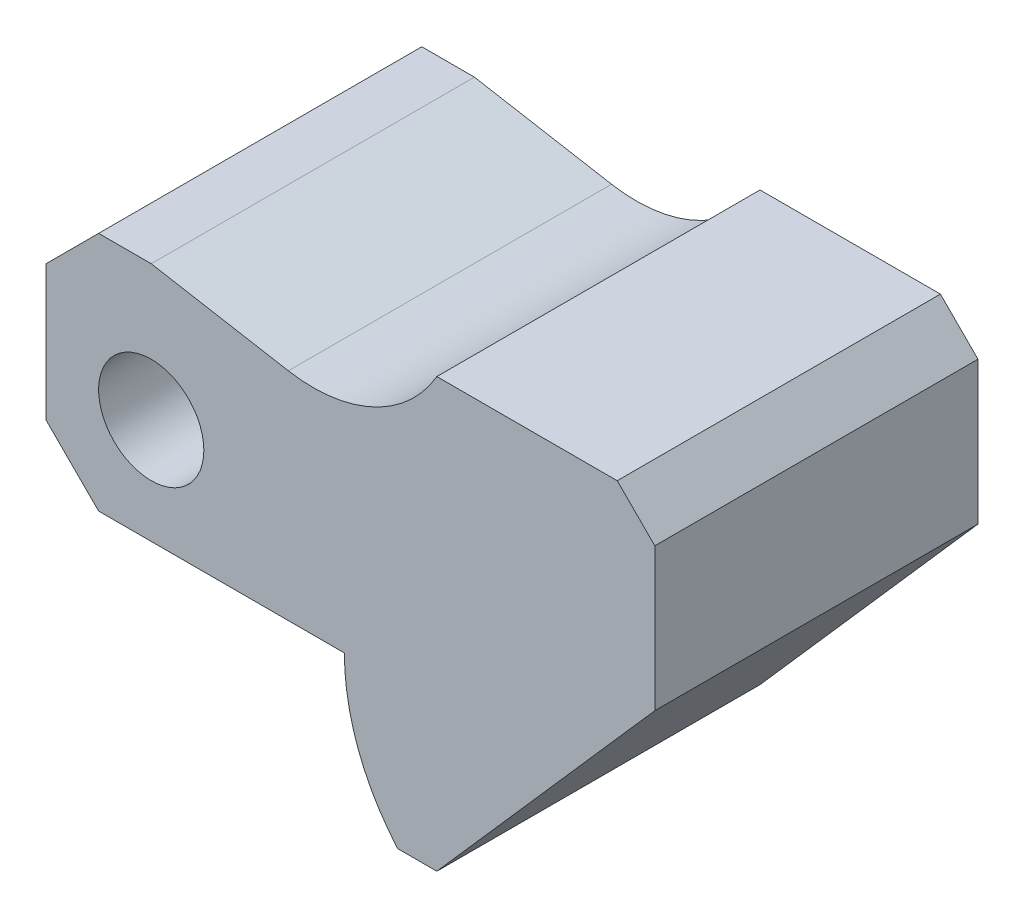
ISO-10303-21;
HEADER;
FILE_DESCRIPTION(('STEP AP214'),'2;1');
FILE_NAME('part.step','',(''),(''),'','','');
FILE_SCHEMA(('AUTOMOTIVE_DESIGN { 1 0 10303 214 1 1 1 1 }'));
ENDSEC;
DATA;
#1=APPLICATION_CONTEXT('core data for automotive mechanical design processes');
#2=APPLICATION_PROTOCOL_DEFINITION('international standard','automotive_design',2000,#1);
#3=PRODUCT_CONTEXT('',#1,'mechanical');
#4=PRODUCT('Part','Part','',(#3));
#5=PRODUCT_RELATED_PRODUCT_CATEGORY('part','',(#4));
#6=PRODUCT_DEFINITION_FORMATION('','',#4);
#7=PRODUCT_DEFINITION_CONTEXT('part definition',#1,'design');
#8=PRODUCT_DEFINITION('design','',#6,#7);
#9=PRODUCT_DEFINITION_SHAPE('','',#8);
#10=(LENGTH_UNIT() NAMED_UNIT(*) SI_UNIT(.MILLI.,.METRE.));
#11=(NAMED_UNIT(*) PLANE_ANGLE_UNIT() SI_UNIT($,.RADIAN.));
#12=(NAMED_UNIT(*) SI_UNIT($,.STERADIAN.) SOLID_ANGLE_UNIT());
#13=UNCERTAINTY_MEASURE_WITH_UNIT(LENGTH_MEASURE(1.E-05),#10,'distance_accuracy_value','');
#14=(GEOMETRIC_REPRESENTATION_CONTEXT(3) GLOBAL_UNCERTAINTY_ASSIGNED_CONTEXT((#13)) GLOBAL_UNIT_ASSIGNED_CONTEXT((#10,
#11,#12)) REPRESENTATION_CONTEXT('',''));
#15=CARTESIAN_POINT('',(0.,0.,0.));
#16=DIRECTION('',(0.,0.,1.));
#17=DIRECTION('',(1.,0.,0.));
#18=AXIS2_PLACEMENT_3D('',#15,#16,#17);
#19=CARTESIAN_POINT('',(52.,-19.,0.));
#20=DIRECTION('',(0.,-1.,0.));
#21=DIRECTION('',(0.,0.,-1.));
#22=AXIS2_PLACEMENT_3D('',#19,#20,#21);
#23=PLANE('',#22);
#24=DIRECTION('',(-1.,0.,0.));
#25=VECTOR('',#24,1.);
#26=CARTESIAN_POINT('',(52.,-19.,43.));
#27=LINE('',#26,#25);
#28=CARTESIAN_POINT('',(23.,-19.,43.));
#29=VERTEX_POINT('',#28);
#30=CARTESIAN_POINT('',(17.7880673967631,-19.,43.));
#31=VERTEX_POINT('',#30);
#32=EDGE_CURVE('E186',#29,#31,#27,.T.);
#33=ORIENTED_EDGE('',*,*,#32,.T.);
#34=DIRECTION('',(0.,0.,1.));
#35=VECTOR('',#34,1.);
#36=CARTESIAN_POINT('',(17.7880673967631,-19.,0.));
#37=LINE('',#36,#35);
#38=CARTESIAN_POINT('',(17.7880673967631,-19.,0.));
#39=VERTEX_POINT('',#38);
#40=EDGE_CURVE('E155',#39,#31,#37,.T.);
#41=ORIENTED_EDGE('',*,*,#40,.F.);
#42=DIRECTION('',(-1.,0.,0.));
#43=VECTOR('',#42,1.);
#44=CARTESIAN_POINT('',(52.,-19.,0.));
#45=LINE('',#44,#43);
#46=CARTESIAN_POINT('',(23.,-19.,0.));
#47=VERTEX_POINT('',#46);
#48=EDGE_CURVE('E160',#47,#39,#45,.T.);
#49=ORIENTED_EDGE('',*,*,#48,.F.);
#50=DIRECTION('',(0.,0.,1.));
#51=VECTOR('',#50,1.);
#52=CARTESIAN_POINT('',(23.,-19.,-9.));
#53=LINE('',#52,#51);
#54=EDGE_CURVE('E54',#47,#29,#53,.T.);
#55=ORIENTED_EDGE('',*,*,#54,.T.);
#56=EDGE_LOOP('',(#33,#41,#49,#55));
#57=FACE_BOUND('',#56,.T.);
#58=ADVANCED_FACE('F40',(#57),#23,.T.);
#59=CARTESIAN_POINT('',(-29.,0.,43.));
#60=DIRECTION('',(0.,0.,-1.));
#61=DIRECTION('',(-1.,0.,0.));
#62=AXIS2_PLACEMENT_3D('',#59,#60,#61);
#63=PLANE('',#62);
#64=CARTESIAN_POINT('',(-15.,14.,43.));
#65=DIRECTION('',(0.,0.,1.));
#66=DIRECTION('',(1.,0.,0.));
#67=AXIS2_PLACEMENT_3D('',#64,#65,#66);
#68=CIRCLE('',#67,7.);
#69=CARTESIAN_POINT('',(-8.,14.,43.));
#70=VERTEX_POINT('',#69);
#71=EDGE_CURVE('E169',#70,#70,#68,.T.);
#72=ORIENTED_EDGE('',*,*,#71,.F.);
#73=EDGE_LOOP('',(#72));
#74=FACE_BOUND('',#73,.T.);
#75=CARTESIAN_POINT('',(39.6969696969697,0.,43.));
#76=DIRECTION('',(0.,0.,1.));
#77=DIRECTION('',(1.,0.,0.));
#78=AXIS2_PLACEMENT_3D('',#75,#76,#77);
#79=CIRCLE('',#78,29.);
#80=CARTESIAN_POINT('',(10.6969696969697,-1.89158424479087E-13,43.));
#81=VERTEX_POINT('',#80);
#82=EDGE_CURVE('E154',#81,#31,#79,.T.);
#83=ORIENTED_EDGE('',*,*,#82,.T.);
#84=ORIENTED_EDGE('',*,*,#32,.F.);
#85=DIRECTION('',(-0.660114607728679,-0.751164898449876,0.));
#86=VECTOR('',#85,1.);
#87=CARTESIAN_POINT('',(52.,14.,43.));
#88=LINE('',#87,#86);
#89=CARTESIAN_POINT('',(52.,14.,43.));
#90=VERTEX_POINT('',#89);
#91=EDGE_CURVE('E164',#90,#29,#88,.T.);
#92=ORIENTED_EDGE('',*,*,#91,.F.);
#93=DIRECTION('',(0.,1.,0.));
#94=VECTOR('',#93,1.);
#95=CARTESIAN_POINT('',(52.,0.,43.));
#96=LINE('',#95,#94);
#97=CARTESIAN_POINT('',(52.,33.,43.));
#98=VERTEX_POINT('',#97);
#99=EDGE_CURVE('E174',#90,#98,#96,.T.);
#100=ORIENTED_EDGE('',*,*,#99,.T.);
#101=DIRECTION('',(-0.707106781186549,0.707106781186546,0.));
#102=VECTOR('',#101,1.);
#103=CARTESIAN_POINT('',(52.,33.,43.));
#104=LINE('',#103,#102);
#105=CARTESIAN_POINT('',(47.,38.,43.));
#106=VERTEX_POINT('',#105);
#107=EDGE_CURVE('E221',#98,#106,#104,.T.);
#108=ORIENTED_EDGE('',*,*,#107,.T.);
#109=DIRECTION('',(-1.,0.,0.));
#110=VECTOR('',#109,1.);
#111=CARTESIAN_POINT('',(52.,38.,43.));
#112=LINE('',#111,#110);
#113=CARTESIAN_POINT('',(23.,38.,43.));
#114=VERTEX_POINT('',#113);
#115=EDGE_CURVE('E180',#106,#114,#112,.T.);
#116=ORIENTED_EDGE('',*,*,#115,.T.);
#117=CARTESIAN_POINT('',(6.54240036354729,47.4945992125119,43.));
#118=DIRECTION('',(0.,0.,-1.));
#119=DIRECTION('',(-1.,0.,0.));
#120=AXIS2_PLACEMENT_3D('',#117,#118,#119);
#121=CIRCLE('',#120,19.);
#122=CARTESIAN_POINT('',(3.24308498787561,28.7832519052799,43.));
#123=VERTEX_POINT('',#122);
#124=EDGE_CURVE('E62',#114,#123,#121,.T.);
#125=ORIENTED_EDGE('',*,*,#124,.T.);
#126=DIRECTION('',(-0.984807753012208,0.173648177666931,0.));
#127=VECTOR('',#126,1.);
#128=CARTESIAN_POINT('',(-23.1055260522907,33.4292229358542,43.));
#129=LINE('',#128,#127);
#130=CARTESIAN_POINT('',(-15.0000000000001,32.,43.));
#131=VERTEX_POINT('',#130);
#132=EDGE_CURVE('E231',#123,#131,#129,.T.);
#133=ORIENTED_EDGE('',*,*,#132,.T.);
#134=DIRECTION('',(1.,0.,0.));
#135=VECTOR('',#134,1.);
#136=CARTESIAN_POINT('',(-29.,32.,43.));
#137=LINE('',#136,#135);
#138=CARTESIAN_POINT('',(-22.,32.,43.));
#139=VERTEX_POINT('',#138);
#140=EDGE_CURVE('E195',#139,#131,#137,.T.);
#141=ORIENTED_EDGE('',*,*,#140,.F.);
#142=DIRECTION('',(0.707106781186546,0.707106781186549,0.));
#143=VECTOR('',#142,1.);
#144=CARTESIAN_POINT('',(-22.,32.,43.));
#145=LINE('',#144,#143);
#146=CARTESIAN_POINT('',(-29.,25.,43.));
#147=VERTEX_POINT('',#146);
#148=EDGE_CURVE('E206',#139,#147,#145,.F.);
#149=ORIENTED_EDGE('',*,*,#148,.T.);
#150=DIRECTION('',(0.,1.,0.));
#151=VECTOR('',#150,1.);
#152=CARTESIAN_POINT('',(-29.,0.,43.));
#153=LINE('',#152,#151);
#154=CARTESIAN_POINT('',(-29.,6.99999999999999,43.));
#155=VERTEX_POINT('',#154);
#156=EDGE_CURVE('E189',#155,#147,#153,.T.);
#157=ORIENTED_EDGE('',*,*,#156,.F.);
#158=DIRECTION('',(0.707106781186549,-0.707106781186546,0.));
#159=VECTOR('',#158,1.);
#160=CARTESIAN_POINT('',(-29.,6.99999999999999,43.));
#161=LINE('',#160,#159);
#162=CARTESIAN_POINT('',(-22.,0.,43.));
#163=VERTEX_POINT('',#162);
#164=EDGE_CURVE('E208',#155,#163,#161,.T.);
#165=ORIENTED_EDGE('',*,*,#164,.T.);
#166=DIRECTION('',(1.,0.,0.));
#167=VECTOR('',#166,1.);
#168=CARTESIAN_POINT('',(-29.,0.,43.));
#169=LINE('',#168,#167);
#170=EDGE_CURVE('E147',#163,#81,#169,.T.);
#171=ORIENTED_EDGE('',*,*,#170,.T.);
#172=EDGE_LOOP('',(#83,#84,#92,#100,#108,#116,#125,#133,#141,#149,#157,#165,#171));
#173=FACE_BOUND('',#172,.T.);
#174=ADVANCED_FACE('F255',(#74,#173),#63,.F.);
#175=CARTESIAN_POINT('',(-29.,0.,0.));
#176=DIRECTION('',(0.,0.,-1.));
#177=DIRECTION('',(0.,1.,0.));
#178=AXIS2_PLACEMENT_3D('',#175,#176,#177);
#179=PLANE('',#178);
#180=CARTESIAN_POINT('',(-15.,14.,0.));
#181=DIRECTION('',(0.,0.,1.));
#182=DIRECTION('',(1.,0.,0.));
#183=AXIS2_PLACEMENT_3D('',#180,#181,#182);
#184=CIRCLE('',#183,7.);
#185=CARTESIAN_POINT('',(-8.,14.,0.));
#186=VERTEX_POINT('',#185);
#187=EDGE_CURVE('E171',#186,#186,#184,.T.);
#188=ORIENTED_EDGE('',*,*,#187,.T.);
#189=EDGE_LOOP('',(#188));
#190=FACE_BOUND('',#189,.T.);
#191=ORIENTED_EDGE('',*,*,#48,.T.);
#192=CARTESIAN_POINT('',(39.6969696969697,0.,0.));
#193=DIRECTION('',(0.,0.,1.));
#194=DIRECTION('',(1.,0.,0.));
#195=AXIS2_PLACEMENT_3D('',#192,#193,#194);
#196=CIRCLE('',#195,29.);
#197=CARTESIAN_POINT('',(10.6969696969697,-1.89158424479087E-13,0.));
#198=VERTEX_POINT('',#197);
#199=EDGE_CURVE('E151',#198,#39,#196,.T.);
#200=ORIENTED_EDGE('',*,*,#199,.F.);
#201=DIRECTION('',(1.,0.,0.));
#202=VECTOR('',#201,1.);
#203=CARTESIAN_POINT('',(-29.,0.,0.));
#204=LINE('',#203,#202);
#205=CARTESIAN_POINT('',(-22.,0.,0.));
#206=VERTEX_POINT('',#205);
#207=EDGE_CURVE('E135',#206,#198,#204,.T.);
#208=ORIENTED_EDGE('',*,*,#207,.F.);
#209=DIRECTION('',(-0.707106781186549,0.707106781186546,0.));
#210=VECTOR('',#209,1.);
#211=CARTESIAN_POINT('',(-25.5,3.50000000000001,0.));
#212=LINE('',#211,#210);
#213=CARTESIAN_POINT('',(-29.,6.99999999999999,0.));
#214=VERTEX_POINT('',#213);
#215=EDGE_CURVE('E213',#206,#214,#212,.T.);
#216=ORIENTED_EDGE('',*,*,#215,.T.);
#217=DIRECTION('',(0.,1.,0.));
#218=VECTOR('',#217,1.);
#219=CARTESIAN_POINT('',(-29.,0.,0.));
#220=LINE('',#219,#218);
#221=CARTESIAN_POINT('',(-29.,25.,0.));
#222=VERTEX_POINT('',#221);
#223=EDGE_CURVE('E192',#214,#222,#220,.T.);
#224=ORIENTED_EDGE('',*,*,#223,.T.);
#225=DIRECTION('',(-0.707106781186546,-0.707106781186549,0.));
#226=VECTOR('',#225,1.);
#227=CARTESIAN_POINT('',(-41.5,12.5,0.));
#228=LINE('',#227,#226);
#229=CARTESIAN_POINT('',(-22.,32.,0.));
#230=VERTEX_POINT('',#229);
#231=EDGE_CURVE('E211',#222,#230,#228,.F.);
#232=ORIENTED_EDGE('',*,*,#231,.T.);
#233=DIRECTION('',(1.,0.,0.));
#234=VECTOR('',#233,1.);
#235=CARTESIAN_POINT('',(-29.,32.,0.));
#236=LINE('',#235,#234);
#237=CARTESIAN_POINT('',(-15.0000000000002,32.,0.));
#238=VERTEX_POINT('',#237);
#239=EDGE_CURVE('E146',#230,#238,#236,.T.);
#240=ORIENTED_EDGE('',*,*,#239,.T.);
#241=DIRECTION('',(-0.984807753012208,0.173648177666931,0.));
#242=VECTOR('',#241,1.);
#243=CARTESIAN_POINT('',(-23.1055260522907,33.4292229358542,0.));
#244=LINE('',#243,#242);
#245=CARTESIAN_POINT('',(3.24308498787561,28.7832519052799,0.));
#246=VERTEX_POINT('',#245);
#247=EDGE_CURVE('E236',#246,#238,#244,.T.);
#248=ORIENTED_EDGE('',*,*,#247,.F.);
#249=CARTESIAN_POINT('',(6.54240036354729,47.4945992125119,0.));
#250=DIRECTION('',(0.,0.,-1.));
#251=DIRECTION('',(0.,1.,0.));
#252=AXIS2_PLACEMENT_3D('',#249,#250,#251);
#253=CIRCLE('',#252,19.);
#254=CARTESIAN_POINT('',(23.,38.,0.));
#255=VERTEX_POINT('',#254);
#256=EDGE_CURVE('E238',#255,#246,#253,.T.);
#257=ORIENTED_EDGE('',*,*,#256,.F.);
#258=DIRECTION('',(-1.,0.,0.));
#259=VECTOR('',#258,1.);
#260=CARTESIAN_POINT('',(52.,38.,0.));
#261=LINE('',#260,#259);
#262=CARTESIAN_POINT('',(47.,38.,0.));
#263=VERTEX_POINT('',#262);
#264=EDGE_CURVE('E182',#263,#255,#261,.T.);
#265=ORIENTED_EDGE('',*,*,#264,.F.);
#266=DIRECTION('',(0.707106781186549,-0.707106781186546,0.));
#267=VECTOR('',#266,1.);
#268=CARTESIAN_POINT('',(27.9999999999998,57.0000000000001,0.));
#269=LINE('',#268,#267);
#270=CARTESIAN_POINT('',(52.,33.,0.));
#271=VERTEX_POINT('',#270);
#272=EDGE_CURVE('E225',#263,#271,#269,.T.);
#273=ORIENTED_EDGE('',*,*,#272,.T.);
#274=DIRECTION('',(0.,1.,0.));
#275=VECTOR('',#274,1.);
#276=CARTESIAN_POINT('',(52.,0.,0.));
#277=LINE('',#276,#275);
#278=CARTESIAN_POINT('',(52.,14.,0.));
#279=VERTEX_POINT('',#278);
#280=EDGE_CURVE('E178',#279,#271,#277,.T.);
#281=ORIENTED_EDGE('',*,*,#280,.F.);
#282=DIRECTION('',(0.660114607728679,0.751164898449876,0.));
#283=VECTOR('',#282,1.);
#284=CARTESIAN_POINT('',(9.76217616580311,-34.0637305699482,0.));
#285=LINE('',#284,#283);
#286=EDGE_CURVE('E11',#47,#279,#285,.T.);
#287=ORIENTED_EDGE('',*,*,#286,.F.);
#288=EDGE_LOOP('',(#191,#200,#208,#216,#224,#232,#240,#248,#257,#265,#273,#281,#287));
#289=FACE_BOUND('',#288,.T.);
#290=ADVANCED_FACE('F158',(#190,#289),#179,.T.);
#291=CARTESIAN_POINT('',(6.54240036354729,47.4945992125119,-0.0100000000000023));
#292=DIRECTION('',(0.,0.,1.));
#293=DIRECTION('',(1.,0.,0.));
#294=AXIS2_PLACEMENT_3D('',#291,#292,#293);
#295=CYLINDRICAL_SURFACE('',#294,19.);
#296=ORIENTED_EDGE('',*,*,#256,.T.);
#297=DIRECTION('',(0.,0.,1.));
#298=VECTOR('',#297,1.);
#299=CARTESIAN_POINT('',(3.24308498787561,28.78325190528,-0.0100000000000023));
#300=LINE('',#299,#298);
#301=EDGE_CURVE('E48',#246,#123,#300,.T.);
#302=ORIENTED_EDGE('',*,*,#301,.T.);
#303=ORIENTED_EDGE('',*,*,#124,.F.);
#304=DIRECTION('',(0.,0.,1.));
#305=VECTOR('',#304,1.);
#306=CARTESIAN_POINT('',(23.,38.,-0.0100000000000039));
#307=LINE('',#306,#305);
#308=EDGE_CURVE('E228',#255,#114,#307,.T.);
#309=ORIENTED_EDGE('',*,*,#308,.F.);
#310=EDGE_LOOP('',(#296,#302,#303,#309));
#311=FACE_BOUND('',#310,.T.);
#312=ADVANCED_FACE('F280',(#311),#295,.F.);
#313=CARTESIAN_POINT('',(-15.,32.,-0.0100000000000023));
#314=DIRECTION('',(-0.173648177666931,-0.984807753012208,0.));
#315=DIRECTION('',(0.984807753012208,-0.173648177666931,0.));
#316=AXIS2_PLACEMENT_3D('',#313,#314,#315);
#317=PLANE('',#316);
#318=ORIENTED_EDGE('',*,*,#247,.T.);
#319=DIRECTION('',(0.,0.,1.));
#320=VECTOR('',#319,1.);
#321=CARTESIAN_POINT('',(-15.0000000000002,32.,0.));
#322=LINE('',#321,#320);
#323=EDGE_CURVE('E233',#238,#131,#322,.T.);
#324=ORIENTED_EDGE('',*,*,#323,.T.);
#325=ORIENTED_EDGE('',*,*,#132,.F.);
#326=ORIENTED_EDGE('',*,*,#301,.F.);
#327=EDGE_LOOP('',(#318,#324,#325,#326));
#328=FACE_BOUND('',#327,.T.);
#329=ADVANCED_FACE('F42',(#328),#317,.F.);
#330=CARTESIAN_POINT('',(52.,0.,0.));
#331=DIRECTION('',(1.,0.,0.));
#332=DIRECTION('',(0.,0.,-1.));
#333=AXIS2_PLACEMENT_3D('',#330,#331,#332);
#334=PLANE('',#333);
#335=DIRECTION('',(0.,0.,1.));
#336=VECTOR('',#335,1.);
#337=CARTESIAN_POINT('',(52.,14.,-9.));
#338=LINE('',#337,#336);
#339=EDGE_CURVE('E167',#279,#90,#338,.T.);
#340=ORIENTED_EDGE('',*,*,#339,.F.);
#341=ORIENTED_EDGE('',*,*,#280,.T.);
#342=DIRECTION('',(0.,0.,1.));
#343=VECTOR('',#342,1.);
#344=CARTESIAN_POINT('',(52.,33.,43.));
#345=LINE('',#344,#343);
#346=EDGE_CURVE('E218',#271,#98,#345,.T.);
#347=ORIENTED_EDGE('',*,*,#346,.T.);
#348=ORIENTED_EDGE('',*,*,#99,.F.);
#349=EDGE_LOOP('',(#340,#341,#347,#348));
#350=FACE_BOUND('',#349,.T.);
#351=ADVANCED_FACE('F283',(#350),#334,.T.);
#352=CARTESIAN_POINT('',(-29.,0.,0.));
#353=DIRECTION('',(0.,1.,0.));
#354=DIRECTION('',(0.,0.,1.));
#355=AXIS2_PLACEMENT_3D('',#352,#353,#354);
#356=PLANE('',#355);
#357=ORIENTED_EDGE('',*,*,#170,.F.);
#358=DIRECTION('',(0.,0.,-1.));
#359=VECTOR('',#358,1.);
#360=CARTESIAN_POINT('',(-22.,0.,0.));
#361=LINE('',#360,#359);
#362=EDGE_CURVE('E142',#163,#206,#361,.T.);
#363=ORIENTED_EDGE('',*,*,#362,.T.);
#364=ORIENTED_EDGE('',*,*,#207,.T.);
#365=DIRECTION('',(0.,0.,1.));
#366=VECTOR('',#365,1.);
#367=CARTESIAN_POINT('',(10.6969696969697,-1.89158424479087E-13,0.));
#368=LINE('',#367,#366);
#369=EDGE_CURVE('E139',#198,#81,#368,.T.);
#370=ORIENTED_EDGE('',*,*,#369,.T.);
#371=EDGE_LOOP('',(#357,#363,#364,#370));
#372=FACE_BOUND('',#371,.T.);
#373=ADVANCED_FACE('F138',(#372),#356,.F.);
#374=CARTESIAN_POINT('',(-29.,6.99999999999999,0.));
#375=DIRECTION('',(-0.707106781186546,-0.707106781186549,0.));
#376=DIRECTION('',(0.,0.,-1.));
#377=AXIS2_PLACEMENT_3D('',#374,#375,#376);
#378=PLANE('',#377);
#379=ORIENTED_EDGE('',*,*,#215,.F.);
#380=ORIENTED_EDGE('',*,*,#362,.F.);
#381=ORIENTED_EDGE('',*,*,#164,.F.);
#382=DIRECTION('',(0.,0.,1.));
#383=VECTOR('',#382,1.);
#384=CARTESIAN_POINT('',(-29.,6.99999999999999,43.));
#385=LINE('',#384,#383);
#386=EDGE_CURVE('E203',#214,#155,#385,.T.);
#387=ORIENTED_EDGE('',*,*,#386,.F.);
#388=EDGE_LOOP('',(#379,#380,#381,#387));
#389=FACE_BOUND('',#388,.T.);
#390=ADVANCED_FACE('F261',(#389),#378,.T.);
#391=CARTESIAN_POINT('',(-29.,0.,0.));
#392=DIRECTION('',(-1.,0.,0.));
#393=DIRECTION('',(0.,0.,1.));
#394=AXIS2_PLACEMENT_3D('',#391,#392,#393);
#395=PLANE('',#394);
#396=ORIENTED_EDGE('',*,*,#223,.F.);
#397=ORIENTED_EDGE('',*,*,#386,.T.);
#398=ORIENTED_EDGE('',*,*,#156,.T.);
#399=DIRECTION('',(0.,0.,-1.));
#400=VECTOR('',#399,1.);
#401=CARTESIAN_POINT('',(-29.,25.,0.));
#402=LINE('',#401,#400);
#403=EDGE_CURVE('E197',#147,#222,#402,.T.);
#404=ORIENTED_EDGE('',*,*,#403,.T.);
#405=EDGE_LOOP('',(#396,#397,#398,#404));
#406=FACE_BOUND('',#405,.T.);
#407=ADVANCED_FACE('F258',(#406),#395,.T.);
#408=CARTESIAN_POINT('',(-22.,32.,0.));
#409=DIRECTION('',(0.707106781186549,-0.707106781186546,0.));
#410=DIRECTION('',(0.,0.,1.));
#411=AXIS2_PLACEMENT_3D('',#408,#409,#410);
#412=PLANE('',#411);
#413=ORIENTED_EDGE('',*,*,#231,.F.);
#414=ORIENTED_EDGE('',*,*,#403,.F.);
#415=ORIENTED_EDGE('',*,*,#148,.F.);
#416=DIRECTION('',(0.,0.,1.));
#417=VECTOR('',#416,1.);
#418=CARTESIAN_POINT('',(-22.,32.,0.));
#419=LINE('',#418,#417);
#420=EDGE_CURVE('E215',#230,#139,#419,.T.);
#421=ORIENTED_EDGE('',*,*,#420,.F.);
#422=EDGE_LOOP('',(#413,#414,#415,#421));
#423=FACE_BOUND('',#422,.T.);
#424=ADVANCED_FACE('F252',(#423),#412,.F.);
#425=CARTESIAN_POINT('',(-29.,32.,0.));
#426=DIRECTION('',(0.,1.,0.));
#427=DIRECTION('',(0.,0.,1.));
#428=AXIS2_PLACEMENT_3D('',#425,#426,#427);
#429=PLANE('',#428);
#430=ORIENTED_EDGE('',*,*,#323,.F.);
#431=ORIENTED_EDGE('',*,*,#239,.F.);
#432=ORIENTED_EDGE('',*,*,#420,.T.);
#433=ORIENTED_EDGE('',*,*,#140,.T.);
#434=EDGE_LOOP('',(#430,#431,#432,#433));
#435=FACE_BOUND('',#434,.T.);
#436=ADVANCED_FACE('F249',(#435),#429,.T.);
#437=CARTESIAN_POINT('',(-15.,14.,0.));
#438=DIRECTION('',(0.,0.,1.));
#439=DIRECTION('',(1.,0.,0.));
#440=AXIS2_PLACEMENT_3D('',#437,#438,#439);
#441=CYLINDRICAL_SURFACE('',#440,7.);
#442=ORIENTED_EDGE('',*,*,#187,.F.);
#443=EDGE_LOOP('',(#442));
#444=FACE_BOUND('',#443,.T.);
#445=ORIENTED_EDGE('',*,*,#71,.T.);
#446=EDGE_LOOP('',(#445));
#447=FACE_BOUND('',#446,.T.);
#448=ADVANCED_FACE('F287',(#444,#447),#441,.F.);
#449=CARTESIAN_POINT('',(52.,33.,0.));
#450=DIRECTION('',(0.707106781186546,0.707106781186549,0.));
#451=DIRECTION('',(0.,0.,-1.));
#452=AXIS2_PLACEMENT_3D('',#449,#450,#451);
#453=PLANE('',#452);
#454=ORIENTED_EDGE('',*,*,#272,.F.);
#455=DIRECTION('',(0.,0.,-1.));
#456=VECTOR('',#455,1.);
#457=CARTESIAN_POINT('',(47.,38.,0.));
#458=LINE('',#457,#456);
#459=EDGE_CURVE('E223',#106,#263,#458,.T.);
#460=ORIENTED_EDGE('',*,*,#459,.F.);
#461=ORIENTED_EDGE('',*,*,#107,.F.);
#462=ORIENTED_EDGE('',*,*,#346,.F.);
#463=EDGE_LOOP('',(#454,#460,#461,#462));
#464=FACE_BOUND('',#463,.T.);
#465=ADVANCED_FACE('F292',(#464),#453,.T.);
#466=CARTESIAN_POINT('',(52.,38.,0.));
#467=DIRECTION('',(0.,-1.,0.));
#468=DIRECTION('',(0.,0.,-1.));
#469=AXIS2_PLACEMENT_3D('',#466,#467,#468);
#470=PLANE('',#469);
#471=ORIENTED_EDGE('',*,*,#264,.T.);
#472=ORIENTED_EDGE('',*,*,#308,.T.);
#473=ORIENTED_EDGE('',*,*,#115,.F.);
#474=ORIENTED_EDGE('',*,*,#459,.T.);
#475=EDGE_LOOP('',(#471,#472,#473,#474));
#476=FACE_BOUND('',#475,.T.);
#477=ADVANCED_FACE('F274',(#476),#470,.F.);
#478=CARTESIAN_POINT('',(52.,14.,-9.));
#479=DIRECTION('',(-0.751164898449876,0.660114607728679,0.));
#480=DIRECTION('',(-0.660114607728679,-0.751164898449876,0.));
#481=AXIS2_PLACEMENT_3D('',#478,#479,#480);
#482=PLANE('',#481);
#483=ORIENTED_EDGE('',*,*,#286,.T.);
#484=ORIENTED_EDGE('',*,*,#339,.T.);
#485=ORIENTED_EDGE('',*,*,#91,.T.);
#486=ORIENTED_EDGE('',*,*,#54,.F.);
#487=EDGE_LOOP('',(#483,#484,#485,#486));
#488=FACE_BOUND('',#487,.T.);
#489=ADVANCED_FACE('F311',(#488),#482,.F.);
#490=CARTESIAN_POINT('',(39.6969696969697,0.,0.));
#491=DIRECTION('',(0.,0.,1.));
#492=DIRECTION('',(1.,0.,0.));
#493=AXIS2_PLACEMENT_3D('',#490,#491,#492);
#494=CYLINDRICAL_SURFACE('',#493,29.);
#495=ORIENTED_EDGE('',*,*,#82,.F.);
#496=ORIENTED_EDGE('',*,*,#369,.F.);
#497=ORIENTED_EDGE('',*,*,#199,.T.);
#498=ORIENTED_EDGE('',*,*,#40,.T.);
#499=EDGE_LOOP('',(#495,#496,#497,#498));
#500=FACE_BOUND('',#499,.T.);
#501=ADVANCED_FACE('F150',(#500),#494,.T.);
#502=CLOSED_SHELL('',(#58,#174,#290,#312,#329,#351,#373,#390,#407,#424,#436,#448,#465,#477,#489,#501));
#503=MANIFOLD_SOLID_BREP('B2',#502);
#504=ADVANCED_BREP_SHAPE_REPRESENTATION('',(#18,#503),#14);
#505=SHAPE_DEFINITION_REPRESENTATION(#9,#504);
ENDSEC;
END-ISO-10303-21;
